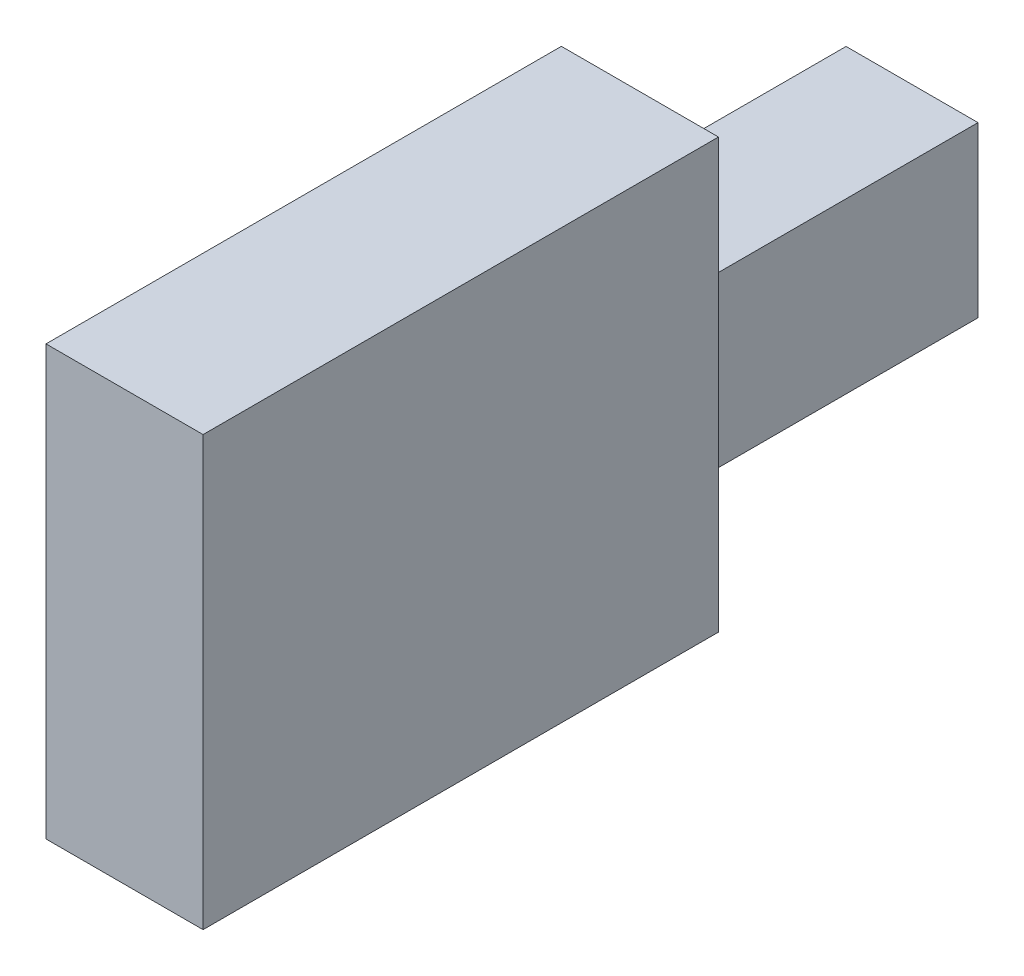
ISO-10303-21;
HEADER;
FILE_DESCRIPTION(('STEP AP214'),'2;1');
FILE_NAME('part.step','',(''),(''),'','','');
FILE_SCHEMA(('AUTOMOTIVE_DESIGN { 1 0 10303 214 1 1 1 1 }'));
ENDSEC;
DATA;
#1=APPLICATION_CONTEXT('core data for automotive mechanical design processes');
#2=APPLICATION_PROTOCOL_DEFINITION('international standard','automotive_design',2000,#1);
#3=PRODUCT_CONTEXT('',#1,'mechanical');
#4=PRODUCT('Part','Part','',(#3));
#5=PRODUCT_RELATED_PRODUCT_CATEGORY('part','',(#4));
#6=PRODUCT_DEFINITION_FORMATION('','',#4);
#7=PRODUCT_DEFINITION_CONTEXT('part definition',#1,'design');
#8=PRODUCT_DEFINITION('design','',#6,#7);
#9=PRODUCT_DEFINITION_SHAPE('','',#8);
#10=(LENGTH_UNIT() NAMED_UNIT(*) SI_UNIT(.MILLI.,.METRE.));
#11=(NAMED_UNIT(*) PLANE_ANGLE_UNIT() SI_UNIT($,.RADIAN.));
#12=(NAMED_UNIT(*) SI_UNIT($,.STERADIAN.) SOLID_ANGLE_UNIT());
#13=UNCERTAINTY_MEASURE_WITH_UNIT(LENGTH_MEASURE(1.E-05),#10,'distance_accuracy_value','');
#14=(GEOMETRIC_REPRESENTATION_CONTEXT(3) GLOBAL_UNCERTAINTY_ASSIGNED_CONTEXT((#13)) GLOBAL_UNIT_ASSIGNED_CONTEXT((#10,
#11,#12)) REPRESENTATION_CONTEXT('',''));
#15=CARTESIAN_POINT('',(0.,0.,0.));
#16=DIRECTION('',(0.,0.,1.));
#17=DIRECTION('',(1.,0.,0.));
#18=AXIS2_PLACEMENT_3D('',#15,#16,#17);
#19=CARTESIAN_POINT('',(1.6,-2.05,6.6));
#20=DIRECTION('',(-1.,0.,0.));
#21=DIRECTION('',(0.,0.,1.));
#22=AXIS2_PLACEMENT_3D('',#19,#20,#21);
#23=PLANE('',#22);
#24=DIRECTION('',(0.,1.,0.));
#25=VECTOR('',#24,1.);
#26=CARTESIAN_POINT('',(1.6,-2.05,0.));
#27=LINE('',#26,#25);
#28=CARTESIAN_POINT('',(1.6,-2.05,0.));
#29=VERTEX_POINT('',#28);
#30=CARTESIAN_POINT('',(1.6,2.05,0.));
#31=VERTEX_POINT('',#30);
#32=EDGE_CURVE('E139',#29,#31,#27,.T.);
#33=ORIENTED_EDGE('',*,*,#32,.T.);
#34=DIRECTION('',(0.,0.,-1.));
#35=VECTOR('',#34,1.);
#36=CARTESIAN_POINT('',(1.6,2.05,6.6));
#37=LINE('',#36,#35);
#38=CARTESIAN_POINT('',(1.6,2.05,6.6));
#39=VERTEX_POINT('',#38);
#40=EDGE_CURVE('E11',#39,#31,#37,.T.);
#41=ORIENTED_EDGE('',*,*,#40,.F.);
#42=DIRECTION('',(0.,1.,0.));
#43=VECTOR('',#42,1.);
#44=CARTESIAN_POINT('',(1.6,-2.05,6.6));
#45=LINE('',#44,#43);
#46=CARTESIAN_POINT('',(1.6,-2.05,6.6));
#47=VERTEX_POINT('',#46);
#48=EDGE_CURVE('E148',#47,#39,#45,.T.);
#49=ORIENTED_EDGE('',*,*,#48,.F.);
#50=DIRECTION('',(0.,0.,-1.));
#51=VECTOR('',#50,1.);
#52=CARTESIAN_POINT('',(1.6,-2.05,6.6));
#53=LINE('',#52,#51);
#54=EDGE_CURVE('E158',#47,#29,#53,.T.);
#55=ORIENTED_EDGE('',*,*,#54,.T.);
#56=EDGE_LOOP('',(#33,#41,#49,#55));
#57=FACE_BOUND('',#56,.T.);
#58=ADVANCED_FACE('F41',(#57),#23,.F.);
#59=CARTESIAN_POINT('',(-1.6,2.05,6.6));
#60=DIRECTION('',(0.,-1.,0.));
#61=DIRECTION('',(0.,0.,-1.));
#62=AXIS2_PLACEMENT_3D('',#59,#60,#61);
#63=PLANE('',#62);
#64=DIRECTION('',(-1.,0.,0.));
#65=VECTOR('',#64,1.);
#66=CARTESIAN_POINT('',(-1.6,2.05,0.));
#67=LINE('',#66,#65);
#68=CARTESIAN_POINT('',(-1.6,2.05,0.));
#69=VERTEX_POINT('',#68);
#70=EDGE_CURVE('E142',#31,#69,#67,.T.);
#71=ORIENTED_EDGE('',*,*,#70,.T.);
#72=DIRECTION('',(0.,0.,-1.));
#73=VECTOR('',#72,1.);
#74=CARTESIAN_POINT('',(-1.6,2.05,6.6));
#75=LINE('',#74,#73);
#76=CARTESIAN_POINT('',(-1.6,2.05,6.6));
#77=VERTEX_POINT('',#76);
#78=EDGE_CURVE('E49',#77,#69,#75,.T.);
#79=ORIENTED_EDGE('',*,*,#78,.F.);
#80=DIRECTION('',(-1.,0.,0.));
#81=VECTOR('',#80,1.);
#82=CARTESIAN_POINT('',(-1.6,2.05,6.6));
#83=LINE('',#82,#81);
#84=EDGE_CURVE('E83',#39,#77,#83,.T.);
#85=ORIENTED_EDGE('',*,*,#84,.F.);
#86=ORIENTED_EDGE('',*,*,#40,.T.);
#87=EDGE_LOOP('',(#71,#79,#85,#86));
#88=FACE_BOUND('',#87,.T.);
#89=ADVANCED_FACE('F185',(#88),#63,.F.);
#90=CARTESIAN_POINT('',(-1.6,-2.05,6.6));
#91=DIRECTION('',(1.,0.,0.));
#92=DIRECTION('',(0.,0.,-1.));
#93=AXIS2_PLACEMENT_3D('',#90,#91,#92);
#94=PLANE('',#93);
#95=DIRECTION('',(0.,-1.,0.));
#96=VECTOR('',#95,1.);
#97=CARTESIAN_POINT('',(-1.6,-2.05,0.));
#98=LINE('',#97,#96);
#99=CARTESIAN_POINT('',(-1.6,-2.05,0.));
#100=VERTEX_POINT('',#99);
#101=EDGE_CURVE('E73',#69,#100,#98,.T.);
#102=ORIENTED_EDGE('',*,*,#101,.T.);
#103=DIRECTION('',(0.,0.,-1.));
#104=VECTOR('',#103,1.);
#105=CARTESIAN_POINT('',(-1.6,-2.05,6.6));
#106=LINE('',#105,#104);
#107=CARTESIAN_POINT('',(-1.6,-2.05,6.6));
#108=VERTEX_POINT('',#107);
#109=EDGE_CURVE('E57',#108,#100,#106,.T.);
#110=ORIENTED_EDGE('',*,*,#109,.F.);
#111=DIRECTION('',(0.,-1.,0.));
#112=VECTOR('',#111,1.);
#113=CARTESIAN_POINT('',(-1.6,-2.05,6.6));
#114=LINE('',#113,#112);
#115=EDGE_CURVE('E153',#77,#108,#114,.T.);
#116=ORIENTED_EDGE('',*,*,#115,.F.);
#117=ORIENTED_EDGE('',*,*,#78,.T.);
#118=EDGE_LOOP('',(#102,#110,#116,#117));
#119=FACE_BOUND('',#118,.T.);
#120=ADVANCED_FACE('F165',(#119),#94,.F.);
#121=CARTESIAN_POINT('',(-1.6,-2.05,6.6));
#122=DIRECTION('',(0.,1.,0.));
#123=DIRECTION('',(0.,0.,1.));
#124=AXIS2_PLACEMENT_3D('',#121,#122,#123);
#125=PLANE('',#124);
#126=DIRECTION('',(1.,0.,0.));
#127=VECTOR('',#126,1.);
#128=CARTESIAN_POINT('',(-1.6,-2.05,0.));
#129=LINE('',#128,#127);
#130=EDGE_CURVE('E78',#100,#29,#129,.T.);
#131=ORIENTED_EDGE('',*,*,#130,.T.);
#132=ORIENTED_EDGE('',*,*,#54,.F.);
#133=DIRECTION('',(1.,0.,0.));
#134=VECTOR('',#133,1.);
#135=CARTESIAN_POINT('',(-1.6,-2.05,6.6));
#136=LINE('',#135,#134);
#137=EDGE_CURVE('E156',#108,#47,#136,.T.);
#138=ORIENTED_EDGE('',*,*,#137,.F.);
#139=ORIENTED_EDGE('',*,*,#109,.T.);
#140=EDGE_LOOP('',(#131,#132,#138,#139));
#141=FACE_BOUND('',#140,.T.);
#142=ADVANCED_FACE('F170',(#141),#125,.F.);
#143=CARTESIAN_POINT('',(0.,0.,0.));
#144=DIRECTION('',(0.,0.,-1.));
#145=DIRECTION('',(-1.,0.,0.));
#146=AXIS2_PLACEMENT_3D('',#143,#144,#145);
#147=PLANE('',#146);
#148=ORIENTED_EDGE('',*,*,#32,.F.);
#149=ORIENTED_EDGE('',*,*,#130,.F.);
#150=ORIENTED_EDGE('',*,*,#101,.F.);
#151=ORIENTED_EDGE('',*,*,#70,.F.);
#152=EDGE_LOOP('',(#148,#149,#150,#151));
#153=FACE_BOUND('',#152,.T.);
#154=ADVANCED_FACE('F168',(#153),#147,.T.);
#155=CARTESIAN_POINT('',(0.,0.,6.6));
#156=DIRECTION('',(0.,0.,1.));
#157=DIRECTION('',(1.,0.,0.));
#158=AXIS2_PLACEMENT_3D('',#155,#156,#157);
#159=PLANE('',#158);
#160=DIRECTION('',(0.,1.,0.));
#161=VECTOR('',#160,1.);
#162=CARTESIAN_POINT('',(1.905,5.2,6.6));
#163=LINE('',#162,#161);
#164=CARTESIAN_POINT('',(1.905,-5.2,6.6));
#165=VERTEX_POINT('',#164);
#166=CARTESIAN_POINT('',(1.905,5.2,6.6));
#167=VERTEX_POINT('',#166);
#168=EDGE_CURVE('E138',#165,#167,#163,.T.);
#169=ORIENTED_EDGE('',*,*,#168,.F.);
#170=DIRECTION('',(1.,0.,0.));
#171=VECTOR('',#170,1.);
#172=CARTESIAN_POINT('',(-1.905,-5.2,6.6));
#173=LINE('',#172,#171);
#174=CARTESIAN_POINT('',(-1.905,-5.2,6.6));
#175=VERTEX_POINT('',#174);
#176=EDGE_CURVE('E134',#175,#165,#173,.T.);
#177=ORIENTED_EDGE('',*,*,#176,.F.);
#178=DIRECTION('',(0.,-1.,0.));
#179=VECTOR('',#178,1.);
#180=CARTESIAN_POINT('',(-1.905,5.2,6.6));
#181=LINE('',#180,#179);
#182=CARTESIAN_POINT('',(-1.905,5.2,6.6));
#183=VERTEX_POINT('',#182);
#184=EDGE_CURVE('E212',#183,#175,#181,.T.);
#185=ORIENTED_EDGE('',*,*,#184,.F.);
#186=DIRECTION('',(-1.,0.,0.));
#187=VECTOR('',#186,1.);
#188=CARTESIAN_POINT('',(-1.905,5.2,6.6));
#189=LINE('',#188,#187);
#190=EDGE_CURVE('E215',#167,#183,#189,.T.);
#191=ORIENTED_EDGE('',*,*,#190,.F.);
#192=EDGE_LOOP('',(#169,#177,#185,#191));
#193=FACE_BOUND('',#192,.T.);
#194=ORIENTED_EDGE('',*,*,#137,.T.);
#195=ORIENTED_EDGE('',*,*,#48,.T.);
#196=ORIENTED_EDGE('',*,*,#84,.T.);
#197=ORIENTED_EDGE('',*,*,#115,.T.);
#198=EDGE_LOOP('',(#194,#195,#196,#197));
#199=FACE_BOUND('',#198,.T.);
#200=ADVANCED_FACE('F172',(#193,#199),#159,.F.);
#201=CARTESIAN_POINT('',(1.905,5.2,19.1));
#202=DIRECTION('',(-1.,0.,0.));
#203=DIRECTION('',(0.,-1.,0.));
#204=AXIS2_PLACEMENT_3D('',#201,#202,#203);
#205=PLANE('',#204);
#206=ORIENTED_EDGE('',*,*,#168,.T.);
#207=DIRECTION('',(0.,0.,-1.));
#208=VECTOR('',#207,1.);
#209=CARTESIAN_POINT('',(1.905,5.2,19.1));
#210=LINE('',#209,#208);
#211=CARTESIAN_POINT('',(1.905,5.2,19.1));
#212=VERTEX_POINT('',#211);
#213=EDGE_CURVE('E118',#212,#167,#210,.T.);
#214=ORIENTED_EDGE('',*,*,#213,.F.);
#215=DIRECTION('',(0.,1.,0.));
#216=VECTOR('',#215,1.);
#217=CARTESIAN_POINT('',(1.905,5.2,19.1));
#218=LINE('',#217,#216);
#219=CARTESIAN_POINT('',(1.905,-5.2,19.1));
#220=VERTEX_POINT('',#219);
#221=EDGE_CURVE('E125',#220,#212,#218,.T.);
#222=ORIENTED_EDGE('',*,*,#221,.F.);
#223=DIRECTION('',(0.,0.,-1.));
#224=VECTOR('',#223,1.);
#225=CARTESIAN_POINT('',(1.905,-5.2,19.1));
#226=LINE('',#225,#224);
#227=EDGE_CURVE('E209',#220,#165,#226,.T.);
#228=ORIENTED_EDGE('',*,*,#227,.T.);
#229=EDGE_LOOP('',(#206,#214,#222,#228));
#230=FACE_BOUND('',#229,.T.);
#231=ADVANCED_FACE('F136',(#230),#205,.F.);
#232=CARTESIAN_POINT('',(-1.905,5.2,19.1));
#233=DIRECTION('',(0.,-1.,0.));
#234=DIRECTION('',(0.,0.,-1.));
#235=AXIS2_PLACEMENT_3D('',#232,#233,#234);
#236=PLANE('',#235);
#237=ORIENTED_EDGE('',*,*,#190,.T.);
#238=DIRECTION('',(0.,0.,-1.));
#239=VECTOR('',#238,1.);
#240=CARTESIAN_POINT('',(-1.905,5.2,19.1));
#241=LINE('',#240,#239);
#242=CARTESIAN_POINT('',(-1.905,5.2,19.1));
#243=VERTEX_POINT('',#242);
#244=EDGE_CURVE('E121',#243,#183,#241,.T.);
#245=ORIENTED_EDGE('',*,*,#244,.F.);
#246=DIRECTION('',(-1.,0.,0.));
#247=VECTOR('',#246,1.);
#248=CARTESIAN_POINT('',(-1.905,5.2,19.1));
#249=LINE('',#248,#247);
#250=EDGE_CURVE('E114',#212,#243,#249,.T.);
#251=ORIENTED_EDGE('',*,*,#250,.F.);
#252=ORIENTED_EDGE('',*,*,#213,.T.);
#253=EDGE_LOOP('',(#237,#245,#251,#252));
#254=FACE_BOUND('',#253,.T.);
#255=ADVANCED_FACE('F116',(#254),#236,.F.);
#256=CARTESIAN_POINT('',(-1.905,5.2,19.1));
#257=DIRECTION('',(1.,0.,0.));
#258=DIRECTION('',(0.,0.,-1.));
#259=AXIS2_PLACEMENT_3D('',#256,#257,#258);
#260=PLANE('',#259);
#261=ORIENTED_EDGE('',*,*,#184,.T.);
#262=DIRECTION('',(0.,0.,-1.));
#263=VECTOR('',#262,1.);
#264=CARTESIAN_POINT('',(-1.905,-5.2,19.1));
#265=LINE('',#264,#263);
#266=CARTESIAN_POINT('',(-1.905,-5.2,19.1));
#267=VERTEX_POINT('',#266);
#268=EDGE_CURVE('E144',#267,#175,#265,.T.);
#269=ORIENTED_EDGE('',*,*,#268,.F.);
#270=DIRECTION('',(0.,-1.,0.));
#271=VECTOR('',#270,1.);
#272=CARTESIAN_POINT('',(-1.905,5.2,19.1));
#273=LINE('',#272,#271);
#274=EDGE_CURVE('E124',#243,#267,#273,.T.);
#275=ORIENTED_EDGE('',*,*,#274,.F.);
#276=ORIENTED_EDGE('',*,*,#244,.T.);
#277=EDGE_LOOP('',(#261,#269,#275,#276));
#278=FACE_BOUND('',#277,.T.);
#279=ADVANCED_FACE('F198',(#278),#260,.F.);
#280=CARTESIAN_POINT('',(-1.905,-5.2,19.1));
#281=DIRECTION('',(0.,1.,0.));
#282=DIRECTION('',(0.,0.,1.));
#283=AXIS2_PLACEMENT_3D('',#280,#281,#282);
#284=PLANE('',#283);
#285=ORIENTED_EDGE('',*,*,#176,.T.);
#286=ORIENTED_EDGE('',*,*,#227,.F.);
#287=DIRECTION('',(1.,0.,0.));
#288=VECTOR('',#287,1.);
#289=CARTESIAN_POINT('',(-1.905,-5.2,19.1));
#290=LINE('',#289,#288);
#291=EDGE_CURVE('E130',#267,#220,#290,.T.);
#292=ORIENTED_EDGE('',*,*,#291,.F.);
#293=ORIENTED_EDGE('',*,*,#268,.T.);
#294=EDGE_LOOP('',(#285,#286,#292,#293));
#295=FACE_BOUND('',#294,.T.);
#296=ADVANCED_FACE('F200',(#295),#284,.F.);
#297=CARTESIAN_POINT('',(0.,0.,19.1));
#298=DIRECTION('',(0.,0.,1.));
#299=DIRECTION('',(1.,0.,0.));
#300=AXIS2_PLACEMENT_3D('',#297,#298,#299);
#301=PLANE('',#300);
#302=ORIENTED_EDGE('',*,*,#221,.T.);
#303=ORIENTED_EDGE('',*,*,#250,.T.);
#304=ORIENTED_EDGE('',*,*,#274,.T.);
#305=ORIENTED_EDGE('',*,*,#291,.T.);
#306=EDGE_LOOP('',(#302,#303,#304,#305));
#307=FACE_BOUND('',#306,.T.);
#308=ADVANCED_FACE('F128',(#307),#301,.T.);
#309=CLOSED_SHELL('',(#58,#89,#120,#142,#154,#200,#231,#255,#279,#296,#308));
#310=MANIFOLD_SOLID_BREP('B2',#309);
#311=ADVANCED_BREP_SHAPE_REPRESENTATION('',(#18,#310),#14);
#312=SHAPE_DEFINITION_REPRESENTATION(#9,#311);
ENDSEC;
END-ISO-10303-21;
